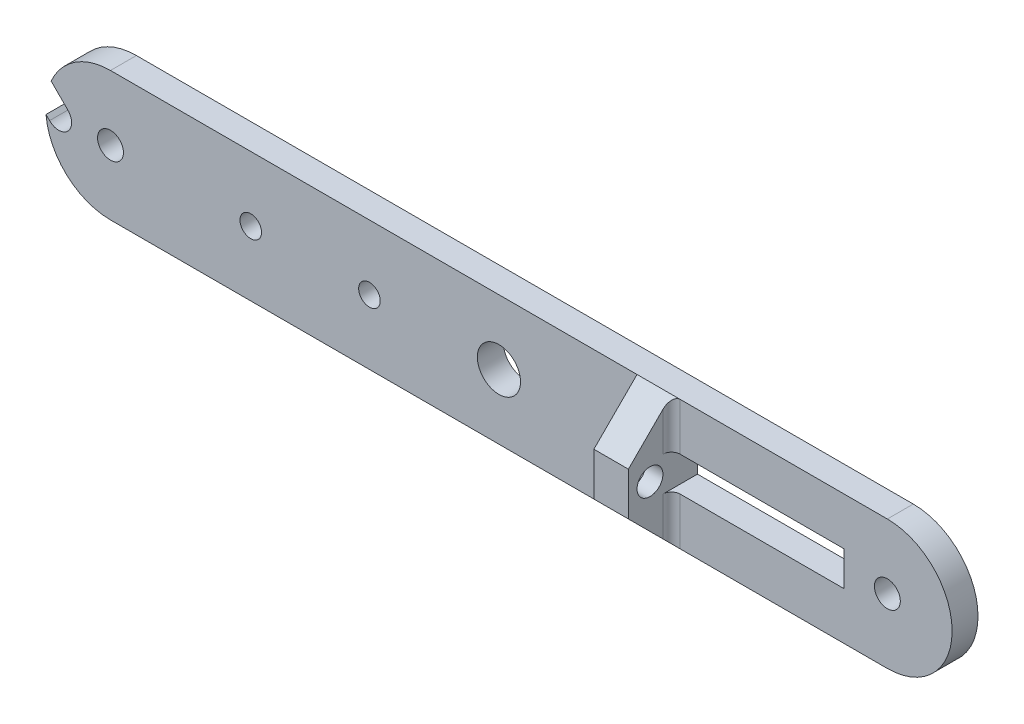
ISO-10303-21;
HEADER;
FILE_DESCRIPTION(('STEP AP214'),'2;1');
FILE_NAME('part.step','',(''),(''),'','','');
FILE_SCHEMA(('AUTOMOTIVE_DESIGN { 1 0 10303 214 1 1 1 1 }'));
ENDSEC;
DATA;
#1=APPLICATION_CONTEXT('core data for automotive mechanical design processes');
#2=APPLICATION_PROTOCOL_DEFINITION('international standard','automotive_design',2000,#1);
#3=PRODUCT_CONTEXT('',#1,'mechanical');
#4=PRODUCT('Part','Part','',(#3));
#5=PRODUCT_RELATED_PRODUCT_CATEGORY('part','',(#4));
#6=PRODUCT_DEFINITION_FORMATION('','',#4);
#7=PRODUCT_DEFINITION_CONTEXT('part definition',#1,'design');
#8=PRODUCT_DEFINITION('design','',#6,#7);
#9=PRODUCT_DEFINITION_SHAPE('','',#8);
#10=(LENGTH_UNIT() NAMED_UNIT(*) SI_UNIT(.MILLI.,.METRE.));
#11=(NAMED_UNIT(*) PLANE_ANGLE_UNIT() SI_UNIT($,.RADIAN.));
#12=(NAMED_UNIT(*) SI_UNIT($,.STERADIAN.) SOLID_ANGLE_UNIT());
#13=UNCERTAINTY_MEASURE_WITH_UNIT(LENGTH_MEASURE(1.E-05),#10,'distance_accuracy_value','');
#14=(GEOMETRIC_REPRESENTATION_CONTEXT(3) GLOBAL_UNCERTAINTY_ASSIGNED_CONTEXT((#13)) GLOBAL_UNIT_ASSIGNED_CONTEXT((#10,
#11,#12)) REPRESENTATION_CONTEXT('',''));
#15=CARTESIAN_POINT('',(0.,0.,0.));
#16=DIRECTION('',(0.,0.,1.));
#17=DIRECTION('',(1.,0.,0.));
#18=AXIS2_PLACEMENT_3D('',#15,#16,#17);
#19=CARTESIAN_POINT('',(90.,0.,6.));
#20=DIRECTION('',(0.,0.,1.));
#21=DIRECTION('',(1.,0.,0.));
#22=AXIS2_PLACEMENT_3D('',#19,#20,#21);
#23=PLANE('',#22);
#24=CARTESIAN_POINT('',(-30.,0.,6.));
#25=DIRECTION('',(0.,0.,1.));
#26=DIRECTION('',(1.,0.,0.));
#27=AXIS2_PLACEMENT_3D('',#24,#25,#26);
#28=CIRCLE('',#27,2.5);
#29=CARTESIAN_POINT('',(-27.5,0.,6.));
#30=VERTEX_POINT('',#29);
#31=EDGE_CURVE('E381',#30,#30,#28,.T.);
#32=ORIENTED_EDGE('',*,*,#31,.F.);
#33=EDGE_LOOP('',(#32));
#34=FACE_BOUND('',#33,.T.);
#35=CARTESIAN_POINT('',(-90.,0.,6.));
#36=DIRECTION('',(0.,0.,1.));
#37=DIRECTION('',(-1.,0.,0.));
#38=AXIS2_PLACEMENT_3D('',#35,#36,#37);
#39=CIRCLE('',#38,3.00000000000001);
#40=CARTESIAN_POINT('',(-93.,0.,6.));
#41=VERTEX_POINT('',#40);
#42=EDGE_CURVE('E393',#41,#41,#39,.T.);
#43=ORIENTED_EDGE('',*,*,#42,.F.);
#44=EDGE_LOOP('',(#43));
#45=FACE_BOUND('',#44,.T.);
#46=CARTESIAN_POINT('',(0.,0.,6.));
#47=DIRECTION('',(0.,0.,1.));
#48=DIRECTION('',(1.,0.,0.));
#49=AXIS2_PLACEMENT_3D('',#46,#47,#48);
#50=CIRCLE('',#49,5.);
#51=CARTESIAN_POINT('',(5.,0.,6.));
#52=VERTEX_POINT('',#51);
#53=EDGE_CURVE('E424',#52,#52,#50,.T.);
#54=ORIENTED_EDGE('',*,*,#53,.F.);
#55=EDGE_LOOP('',(#54));
#56=FACE_BOUND('',#55,.T.);
#57=CARTESIAN_POINT('',(-57.5,0.,6.));
#58=DIRECTION('',(0.,0.,1.));
#59=DIRECTION('',(1.,0.,0.));
#60=AXIS2_PLACEMENT_3D('',#57,#58,#59);
#61=CIRCLE('',#60,2.50000000000001);
#62=CARTESIAN_POINT('',(-55.,0.,6.));
#63=VERTEX_POINT('',#62);
#64=EDGE_CURVE('E387',#63,#63,#61,.T.);
#65=ORIENTED_EDGE('',*,*,#64,.F.);
#66=EDGE_LOOP('',(#65));
#67=FACE_BOUND('',#66,.T.);
#68=CARTESIAN_POINT('',(-102.,0.,6.));
#69=DIRECTION('',(0.,0.,1.));
#70=DIRECTION('',(1.,0.,0.));
#71=AXIS2_PLACEMENT_3D('',#68,#69,#70);
#72=CIRCLE('',#71,3.00000000000001);
#73=CARTESIAN_POINT('',(-104.12132034356,-2.12132034355964,6.));
#74=VERTEX_POINT('',#73);
#75=CARTESIAN_POINT('',(-99.8786796564403,2.12132034355964,6.));
#76=VERTEX_POINT('',#75);
#77=EDGE_CURVE('E199',#74,#76,#72,.T.);
#78=ORIENTED_EDGE('',*,*,#77,.F.);
#79=DIRECTION('',(-0.707106781186549,0.707106781186547,0.));
#80=VECTOR('',#79,1.);
#81=CARTESIAN_POINT('',(-53.1213203435595,-53.1213203435596,6.));
#82=LINE('',#81,#80);
#83=CARTESIAN_POINT('',(-104.943648089812,-1.29899259730732,6.));
#84=VERTEX_POINT('',#83);
#85=EDGE_CURVE('E205',#74,#84,#82,.T.);
#86=ORIENTED_EDGE('',*,*,#85,.T.);
#87=CARTESIAN_POINT('',(-90.,0.,6.));
#88=DIRECTION('',(0.,0.,1.));
#89=DIRECTION('',(-1.,0.,0.));
#90=AXIS2_PLACEMENT_3D('',#87,#88,#89);
#91=CIRCLE('',#90,15.);
#92=CARTESIAN_POINT('',(-90.,-15.,6.));
#93=VERTEX_POINT('',#92);
#94=EDGE_CURVE('E349',#84,#93,#91,.T.);
#95=ORIENTED_EDGE('',*,*,#94,.T.);
#96=DIRECTION('',(1.,0.,0.));
#97=VECTOR('',#96,1.);
#98=CARTESIAN_POINT('',(90.,-15.,6.));
#99=LINE('',#98,#97);
#100=CARTESIAN_POINT('',(32.,-15.,6.));
#101=VERTEX_POINT('',#100);
#102=EDGE_CURVE('E351',#93,#101,#99,.T.);
#103=ORIENTED_EDGE('',*,*,#102,.T.);
#104=DIRECTION('',(0.,1.,0.));
#105=VECTOR('',#104,1.);
#106=CARTESIAN_POINT('',(32.,-15.,6.));
#107=LINE('',#106,#105);
#108=CARTESIAN_POINT('',(32.,15.,6.));
#109=VERTEX_POINT('',#108);
#110=EDGE_CURVE('E277',#101,#109,#107,.T.);
#111=ORIENTED_EDGE('',*,*,#110,.T.);
#112=DIRECTION('',(-1.,0.,0.));
#113=VECTOR('',#112,1.);
#114=CARTESIAN_POINT('',(90.,15.,6.));
#115=LINE('',#114,#113);
#116=CARTESIAN_POINT('',(-90.,15.,6.));
#117=VERTEX_POINT('',#116);
#118=EDGE_CURVE('E347',#109,#117,#115,.T.);
#119=ORIENTED_EDGE('',*,*,#118,.T.);
#120=CARTESIAN_POINT('',(-103.750652312537,5.9932929996561,6.));
#121=VERTEX_POINT('',#120);
#122=EDGE_CURVE('E343',#117,#121,#91,.T.);
#123=ORIENTED_EDGE('',*,*,#122,.T.);
#124=DIRECTION('',(-0.707106781186548,0.707106781186548,0.));
#125=VECTOR('',#124,1.);
#126=CARTESIAN_POINT('',(-48.8786796564403,-48.8786796564403,6.));
#127=LINE('',#126,#125);
#128=EDGE_CURVE('E48',#76,#121,#127,.T.);
#129=ORIENTED_EDGE('',*,*,#128,.F.);
#130=EDGE_LOOP('',(#78,#86,#95,#103,#111,#119,#123,#129));
#131=FACE_BOUND('',#130,.T.);
#132=ADVANCED_FACE('F33',(#34,#45,#56,#67,#131),#23,.T.);
#133=CARTESIAN_POINT('',(90.,0.,0.));
#134=DIRECTION('',(0.,0.,1.));
#135=DIRECTION('',(1.,0.,0.));
#136=AXIS2_PLACEMENT_3D('',#133,#134,#135);
#137=PLANE('',#136);
#138=CARTESIAN_POINT('',(-30.,0.,0.));
#139=DIRECTION('',(0.,0.,1.));
#140=DIRECTION('',(1.,0.,0.));
#141=AXIS2_PLACEMENT_3D('',#138,#139,#140);
#142=CIRCLE('',#141,2.5);
#143=CARTESIAN_POINT('',(-27.5,0.,0.));
#144=VERTEX_POINT('',#143);
#145=EDGE_CURVE('E287',#144,#144,#142,.T.);
#146=ORIENTED_EDGE('',*,*,#145,.T.);
#147=EDGE_LOOP('',(#146));
#148=FACE_BOUND('',#147,.T.);
#149=CARTESIAN_POINT('',(-57.5,0.,0.));
#150=DIRECTION('',(0.,0.,1.));
#151=DIRECTION('',(1.,0.,0.));
#152=AXIS2_PLACEMENT_3D('',#149,#150,#151);
#153=CIRCLE('',#152,2.50000000000001);
#154=CARTESIAN_POINT('',(-55.,0.,0.));
#155=VERTEX_POINT('',#154);
#156=EDGE_CURVE('E384',#155,#155,#153,.T.);
#157=ORIENTED_EDGE('',*,*,#156,.T.);
#158=EDGE_LOOP('',(#157));
#159=FACE_BOUND('',#158,.T.);
#160=CARTESIAN_POINT('',(-90.,0.,0.));
#161=DIRECTION('',(0.,0.,1.));
#162=DIRECTION('',(-1.,0.,0.));
#163=AXIS2_PLACEMENT_3D('',#160,#161,#162);
#164=CIRCLE('',#163,3.00000000000001);
#165=CARTESIAN_POINT('',(-93.,0.,0.));
#166=VERTEX_POINT('',#165);
#167=EDGE_CURVE('E390',#166,#166,#164,.T.);
#168=ORIENTED_EDGE('',*,*,#167,.T.);
#169=EDGE_LOOP('',(#168));
#170=FACE_BOUND('',#169,.T.);
#171=DIRECTION('',(0.,1.,0.));
#172=VECTOR('',#171,1.);
#173=CARTESIAN_POINT('',(80.,-4.,0.));
#174=LINE('',#173,#172);
#175=CARTESIAN_POINT('',(80.,-4.,0.));
#176=VERTEX_POINT('',#175);
#177=CARTESIAN_POINT('',(80.,4.,0.));
#178=VERTEX_POINT('',#177);
#179=EDGE_CURVE('E396',#176,#178,#174,.T.);
#180=ORIENTED_EDGE('',*,*,#179,.T.);
#181=DIRECTION('',(-1.,0.,0.));
#182=VECTOR('',#181,1.);
#183=CARTESIAN_POINT('',(40.,4.,0.));
#184=LINE('',#183,#182);
#185=CARTESIAN_POINT('',(40.,4.,0.));
#186=VERTEX_POINT('',#185);
#187=EDGE_CURVE('E404',#178,#186,#184,.T.);
#188=ORIENTED_EDGE('',*,*,#187,.T.);
#189=DIRECTION('',(0.,-1.,0.));
#190=VECTOR('',#189,1.);
#191=CARTESIAN_POINT('',(40.,-4.,0.));
#192=LINE('',#191,#190);
#193=CARTESIAN_POINT('',(40.,-4.,0.));
#194=VERTEX_POINT('',#193);
#195=EDGE_CURVE('E407',#186,#194,#192,.T.);
#196=ORIENTED_EDGE('',*,*,#195,.T.);
#197=DIRECTION('',(1.,0.,0.));
#198=VECTOR('',#197,1.);
#199=CARTESIAN_POINT('',(40.,-4.,0.));
#200=LINE('',#199,#198);
#201=EDGE_CURVE('E401',#194,#176,#200,.T.);
#202=ORIENTED_EDGE('',*,*,#201,.T.);
#203=EDGE_LOOP('',(#180,#188,#196,#202));
#204=FACE_BOUND('',#203,.T.);
#205=CARTESIAN_POINT('',(0.,0.,0.));
#206=DIRECTION('',(0.,0.,1.));
#207=DIRECTION('',(1.,0.,0.));
#208=AXIS2_PLACEMENT_3D('',#205,#206,#207);
#209=CIRCLE('',#208,5.);
#210=CARTESIAN_POINT('',(5.,0.,0.));
#211=VERTEX_POINT('',#210);
#212=EDGE_CURVE('E421',#211,#211,#209,.T.);
#213=ORIENTED_EDGE('',*,*,#212,.T.);
#214=EDGE_LOOP('',(#213));
#215=FACE_BOUND('',#214,.T.);
#216=CARTESIAN_POINT('',(90.,0.,0.));
#217=DIRECTION('',(0.,0.,1.));
#218=DIRECTION('',(1.,0.,0.));
#219=AXIS2_PLACEMENT_3D('',#216,#217,#218);
#220=CIRCLE('',#219,3.00000000000001);
#221=CARTESIAN_POINT('',(93.,0.,0.));
#222=VERTEX_POINT('',#221);
#223=EDGE_CURVE('E417',#222,#222,#220,.T.);
#224=ORIENTED_EDGE('',*,*,#223,.T.);
#225=EDGE_LOOP('',(#224));
#226=FACE_BOUND('',#225,.T.);
#227=DIRECTION('',(-0.707106781186549,0.707106781186547,0.));
#228=VECTOR('',#227,1.);
#229=CARTESIAN_POINT('',(-8.12132034355938,-98.1213203435596,0.));
#230=LINE('',#229,#228);
#231=CARTESIAN_POINT('',(-104.12132034356,-2.12132034355964,0.));
#232=VERTEX_POINT('',#231);
#233=CARTESIAN_POINT('',(-104.943648089812,-1.29899259730732,0.));
#234=VERTEX_POINT('',#233);
#235=EDGE_CURVE('E219',#232,#234,#230,.T.);
#236=ORIENTED_EDGE('',*,*,#235,.F.);
#237=CARTESIAN_POINT('',(-102.,0.,0.));
#238=DIRECTION('',(0.,0.,1.));
#239=DIRECTION('',(1.,0.,0.));
#240=AXIS2_PLACEMENT_3D('',#237,#238,#239);
#241=CIRCLE('',#240,3.00000000000001);
#242=CARTESIAN_POINT('',(-99.8786796564403,2.12132034355964,0.));
#243=VERTEX_POINT('',#242);
#244=EDGE_CURVE('E11',#232,#243,#241,.T.);
#245=ORIENTED_EDGE('',*,*,#244,.T.);
#246=DIRECTION('',(-0.707106781186548,0.707106781186548,0.));
#247=VECTOR('',#246,1.);
#248=CARTESIAN_POINT('',(-3.87867965644031,-93.8786796564403,0.));
#249=LINE('',#248,#247);
#250=CARTESIAN_POINT('',(-103.750652312537,5.9932929996561,0.));
#251=VERTEX_POINT('',#250);
#252=EDGE_CURVE('E215',#243,#251,#249,.T.);
#253=ORIENTED_EDGE('',*,*,#252,.T.);
#254=CARTESIAN_POINT('',(-90.,0.,0.));
#255=DIRECTION('',(0.,0.,1.));
#256=DIRECTION('',(-1.,0.,0.));
#257=AXIS2_PLACEMENT_3D('',#254,#255,#256);
#258=CIRCLE('',#257,15.);
#259=CARTESIAN_POINT('',(-90.,15.,0.));
#260=VERTEX_POINT('',#259);
#261=EDGE_CURVE('E345',#260,#251,#258,.T.);
#262=ORIENTED_EDGE('',*,*,#261,.F.);
#263=DIRECTION('',(-1.,0.,0.));
#264=VECTOR('',#263,1.);
#265=CARTESIAN_POINT('',(90.,15.,0.));
#266=LINE('',#265,#264);
#267=CARTESIAN_POINT('',(90.,15.,0.));
#268=VERTEX_POINT('',#267);
#269=EDGE_CURVE('E495',#268,#260,#266,.T.);
#270=ORIENTED_EDGE('',*,*,#269,.F.);
#271=CARTESIAN_POINT('',(90.,0.,0.));
#272=DIRECTION('',(0.,0.,1.));
#273=DIRECTION('',(1.,0.,0.));
#274=AXIS2_PLACEMENT_3D('',#271,#272,#273);
#275=CIRCLE('',#274,15.);
#276=CARTESIAN_POINT('',(90.,-15.,0.));
#277=VERTEX_POINT('',#276);
#278=EDGE_CURVE('E358',#277,#268,#275,.T.);
#279=ORIENTED_EDGE('',*,*,#278,.F.);
#280=DIRECTION('',(1.,0.,0.));
#281=VECTOR('',#280,1.);
#282=CARTESIAN_POINT('',(90.,-15.,0.));
#283=LINE('',#282,#281);
#284=CARTESIAN_POINT('',(-90.,-15.,0.));
#285=VERTEX_POINT('',#284);
#286=EDGE_CURVE('E430',#285,#277,#283,.T.);
#287=ORIENTED_EDGE('',*,*,#286,.F.);
#288=EDGE_CURVE('E440',#234,#285,#258,.T.);
#289=ORIENTED_EDGE('',*,*,#288,.F.);
#290=EDGE_LOOP('',(#236,#245,#253,#262,#270,#279,#287,#289));
#291=FACE_BOUND('',#290,.T.);
#292=ADVANCED_FACE('F476',(#148,#159,#170,#204,#215,#226,#291),#137,.F.);
#293=CARTESIAN_POINT('',(-90.,0.,6.));
#294=DIRECTION('',(0.,0.,-1.));
#295=DIRECTION('',(-1.,0.,0.));
#296=AXIS2_PLACEMENT_3D('',#293,#294,#295);
#297=CYLINDRICAL_SURFACE('',#296,15.);
#298=DIRECTION('',(0.,0.,-1.));
#299=VECTOR('',#298,1.);
#300=CARTESIAN_POINT('',(-104.943648089812,-1.29899259730732,6.));
#301=LINE('',#300,#299);
#302=EDGE_CURVE('E41',#234,#84,#301,.F.);
#303=ORIENTED_EDGE('',*,*,#302,.F.);
#304=ORIENTED_EDGE('',*,*,#288,.T.);
#305=DIRECTION('',(0.,0.,-1.));
#306=VECTOR('',#305,1.);
#307=CARTESIAN_POINT('',(-90.,-15.,6.));
#308=LINE('',#307,#306);
#309=EDGE_CURVE('E444',#93,#285,#308,.T.);
#310=ORIENTED_EDGE('',*,*,#309,.F.);
#311=ORIENTED_EDGE('',*,*,#94,.F.);
#312=EDGE_LOOP('',(#303,#304,#310,#311));
#313=FACE_BOUND('',#312,.T.);
#314=ADVANCED_FACE('F511',(#313),#297,.T.);
#315=CARTESIAN_POINT('',(90.,15.,6.));
#316=VERTEX_POINT('',#315);
#317=CARTESIAN_POINT('',(42.,15.,6.));
#318=VERTEX_POINT('',#317);
#319=EDGE_CURVE('E352',#316,#318,#115,.T.);
#320=ORIENTED_EDGE('',*,*,#319,.T.);
#321=DIRECTION('',(0.,1.,0.));
#322=VECTOR('',#321,1.);
#323=CARTESIAN_POINT('',(42.,4.,6.));
#324=LINE('',#323,#322);
#325=CARTESIAN_POINT('',(42.,4.,6.));
#326=VERTEX_POINT('',#325);
#327=EDGE_CURVE('E322',#318,#326,#324,.F.);
#328=ORIENTED_EDGE('',*,*,#327,.T.);
#329=DIRECTION('',(-1.,0.,0.));
#330=VECTOR('',#329,1.);
#331=CARTESIAN_POINT('',(40.,4.,6.));
#332=LINE('',#331,#330);
#333=CARTESIAN_POINT('',(80.,4.,6.));
#334=VERTEX_POINT('',#333);
#335=EDGE_CURVE('E310',#334,#326,#332,.T.);
#336=ORIENTED_EDGE('',*,*,#335,.F.);
#337=DIRECTION('',(0.,1.,0.));
#338=VECTOR('',#337,1.);
#339=CARTESIAN_POINT('',(80.,-4.,6.));
#340=LINE('',#339,#338);
#341=CARTESIAN_POINT('',(80.,-4.,6.));
#342=VERTEX_POINT('',#341);
#343=EDGE_CURVE('E399',#342,#334,#340,.T.);
#344=ORIENTED_EDGE('',*,*,#343,.F.);
#345=DIRECTION('',(1.,0.,0.));
#346=VECTOR('',#345,1.);
#347=CARTESIAN_POINT('',(40.,-4.,6.));
#348=LINE('',#347,#346);
#349=CARTESIAN_POINT('',(42.,-4.,6.));
#350=VERTEX_POINT('',#349);
#351=EDGE_CURVE('E313',#350,#342,#348,.T.);
#352=ORIENTED_EDGE('',*,*,#351,.F.);
#353=DIRECTION('',(0.,1.,0.));
#354=VECTOR('',#353,1.);
#355=CARTESIAN_POINT('',(42.,-15.,6.));
#356=LINE('',#355,#354);
#357=CARTESIAN_POINT('',(42.,-15.,6.));
#358=VERTEX_POINT('',#357);
#359=EDGE_CURVE('E319',#350,#358,#356,.F.);
#360=ORIENTED_EDGE('',*,*,#359,.T.);
#361=CARTESIAN_POINT('',(90.,-15.,6.));
#362=VERTEX_POINT('',#361);
#363=EDGE_CURVE('E316',#358,#362,#99,.T.);
#364=ORIENTED_EDGE('',*,*,#363,.T.);
#365=CARTESIAN_POINT('',(90.,0.,6.));
#366=DIRECTION('',(0.,0.,1.));
#367=DIRECTION('',(1.,0.,0.));
#368=AXIS2_PLACEMENT_3D('',#365,#366,#367);
#369=CIRCLE('',#368,15.);
#370=EDGE_CURVE('E428',#362,#316,#369,.T.);
#371=ORIENTED_EDGE('',*,*,#370,.T.);
#372=EDGE_LOOP('',(#320,#328,#336,#344,#352,#360,#364,#371));
#373=FACE_BOUND('',#372,.T.);
#374=CARTESIAN_POINT('',(90.,0.,6.));
#375=DIRECTION('',(0.,0.,1.));
#376=DIRECTION('',(1.,0.,0.));
#377=AXIS2_PLACEMENT_3D('',#374,#375,#376);
#378=CIRCLE('',#377,3.00000000000001);
#379=CARTESIAN_POINT('',(93.,0.,6.));
#380=VERTEX_POINT('',#379);
#381=EDGE_CURVE('E418',#380,#380,#378,.T.);
#382=ORIENTED_EDGE('',*,*,#381,.F.);
#383=EDGE_LOOP('',(#382));
#384=FACE_BOUND('',#383,.T.);
#385=ADVANCED_FACE('F451',(#373,#384),#23,.T.);
#386=CARTESIAN_POINT('',(90.,0.,6.));
#387=DIRECTION('',(0.,0.,-1.));
#388=DIRECTION('',(-1.,0.,0.));
#389=AXIS2_PLACEMENT_3D('',#386,#387,#388);
#390=CYLINDRICAL_SURFACE('',#389,15.);
#391=ORIENTED_EDGE('',*,*,#278,.T.);
#392=DIRECTION('',(0.,0.,-1.));
#393=VECTOR('',#392,1.);
#394=CARTESIAN_POINT('',(90.,15.,6.));
#395=LINE('',#394,#393);
#396=EDGE_CURVE('E448',#316,#268,#395,.T.);
#397=ORIENTED_EDGE('',*,*,#396,.F.);
#398=ORIENTED_EDGE('',*,*,#370,.F.);
#399=DIRECTION('',(0.,0.,-1.));
#400=VECTOR('',#399,1.);
#401=CARTESIAN_POINT('',(90.,-15.,6.));
#402=LINE('',#401,#400);
#403=EDGE_CURVE('E365',#362,#277,#402,.T.);
#404=ORIENTED_EDGE('',*,*,#403,.T.);
#405=EDGE_LOOP('',(#391,#397,#398,#404));
#406=FACE_BOUND('',#405,.T.);
#407=ADVANCED_FACE('F493',(#406),#390,.T.);
#408=CARTESIAN_POINT('',(90.,15.,6.));
#409=DIRECTION('',(0.,-1.,0.));
#410=DIRECTION('',(0.,0.,-1.));
#411=AXIS2_PLACEMENT_3D('',#408,#409,#410);
#412=PLANE('',#411);
#413=ORIENTED_EDGE('',*,*,#269,.T.);
#414=DIRECTION('',(0.,0.,-1.));
#415=VECTOR('',#414,1.);
#416=CARTESIAN_POINT('',(-90.,15.,6.));
#417=LINE('',#416,#415);
#418=EDGE_CURVE('E446',#117,#260,#417,.T.);
#419=ORIENTED_EDGE('',*,*,#418,.F.);
#420=ORIENTED_EDGE('',*,*,#118,.F.);
#421=DIRECTION('',(1.,0.,0.));
#422=VECTOR('',#421,1.);
#423=CARTESIAN_POINT('',(32.,15.,6.));
#424=LINE('',#423,#422);
#425=EDGE_CURVE('E294',#109,#318,#424,.T.);
#426=ORIENTED_EDGE('',*,*,#425,.T.);
#427=ORIENTED_EDGE('',*,*,#319,.F.);
#428=ORIENTED_EDGE('',*,*,#396,.T.);
#429=EDGE_LOOP('',(#413,#419,#420,#426,#427,#428));
#430=FACE_BOUND('',#429,.T.);
#431=ADVANCED_FACE('F494',(#430),#412,.F.);
#432=ORIENTED_EDGE('',*,*,#261,.T.);
#433=DIRECTION('',(0.,0.,-1.));
#434=VECTOR('',#433,1.);
#435=CARTESIAN_POINT('',(-103.750652312537,5.9932929996561,6.));
#436=LINE('',#435,#434);
#437=EDGE_CURVE('E335',#251,#121,#436,.F.);
#438=ORIENTED_EDGE('',*,*,#437,.T.);
#439=ORIENTED_EDGE('',*,*,#122,.F.);
#440=ORIENTED_EDGE('',*,*,#418,.T.);
#441=EDGE_LOOP('',(#432,#438,#439,#440));
#442=FACE_BOUND('',#441,.T.);
#443=ADVANCED_FACE('F341',(#442),#297,.T.);
#444=CARTESIAN_POINT('',(90.,-15.,6.));
#445=DIRECTION('',(0.,1.,0.));
#446=DIRECTION('',(0.,0.,1.));
#447=AXIS2_PLACEMENT_3D('',#444,#445,#446);
#448=PLANE('',#447);
#449=ORIENTED_EDGE('',*,*,#286,.T.);
#450=ORIENTED_EDGE('',*,*,#403,.F.);
#451=ORIENTED_EDGE('',*,*,#363,.F.);
#452=DIRECTION('',(1.,0.,0.));
#453=VECTOR('',#452,1.);
#454=CARTESIAN_POINT('',(32.,-15.,6.));
#455=LINE('',#454,#453);
#456=EDGE_CURVE('E285',#101,#358,#455,.T.);
#457=ORIENTED_EDGE('',*,*,#456,.F.);
#458=ORIENTED_EDGE('',*,*,#102,.F.);
#459=ORIENTED_EDGE('',*,*,#309,.T.);
#460=EDGE_LOOP('',(#449,#450,#451,#457,#458,#459));
#461=FACE_BOUND('',#460,.T.);
#462=ADVANCED_FACE('F488',(#461),#448,.F.);
#463=CARTESIAN_POINT('',(0.,0.,6.));
#464=DIRECTION('',(0.,0.,-1.));
#465=DIRECTION('',(-1.,0.,0.));
#466=AXIS2_PLACEMENT_3D('',#463,#464,#465);
#467=CYLINDRICAL_SURFACE('',#466,5.);
#468=ORIENTED_EDGE('',*,*,#53,.T.);
#469=EDGE_LOOP('',(#468));
#470=FACE_BOUND('',#469,.T.);
#471=ORIENTED_EDGE('',*,*,#212,.F.);
#472=EDGE_LOOP('',(#471));
#473=FACE_BOUND('',#472,.T.);
#474=ADVANCED_FACE('F534',(#470,#473),#467,.F.);
#475=CARTESIAN_POINT('',(90.,0.,6.));
#476=DIRECTION('',(0.,0.,-1.));
#477=DIRECTION('',(-1.,0.,0.));
#478=AXIS2_PLACEMENT_3D('',#475,#476,#477);
#479=CYLINDRICAL_SURFACE('',#478,3.00000000000001);
#480=ORIENTED_EDGE('',*,*,#381,.T.);
#481=EDGE_LOOP('',(#480));
#482=FACE_BOUND('',#481,.T.);
#483=ORIENTED_EDGE('',*,*,#223,.F.);
#484=EDGE_LOOP('',(#483));
#485=FACE_BOUND('',#484,.T.);
#486=ADVANCED_FACE('F587',(#482,#485),#479,.F.);
#487=CARTESIAN_POINT('',(80.,-4.,6.));
#488=DIRECTION('',(-1.,0.,0.));
#489=DIRECTION('',(0.,0.,1.));
#490=AXIS2_PLACEMENT_3D('',#487,#488,#489);
#491=PLANE('',#490);
#492=ORIENTED_EDGE('',*,*,#179,.F.);
#493=DIRECTION('',(0.,0.,-1.));
#494=VECTOR('',#493,1.);
#495=CARTESIAN_POINT('',(80.,-4.,6.));
#496=LINE('',#495,#494);
#497=EDGE_CURVE('E305',#342,#176,#496,.T.);
#498=ORIENTED_EDGE('',*,*,#497,.F.);
#499=ORIENTED_EDGE('',*,*,#343,.T.);
#500=DIRECTION('',(0.,0.,-1.));
#501=VECTOR('',#500,1.);
#502=CARTESIAN_POINT('',(80.,4.,6.));
#503=LINE('',#502,#501);
#504=EDGE_CURVE('E414',#334,#178,#503,.T.);
#505=ORIENTED_EDGE('',*,*,#504,.T.);
#506=EDGE_LOOP('',(#492,#498,#499,#505));
#507=FACE_BOUND('',#506,.T.);
#508=ADVANCED_FACE('F471',(#507),#491,.T.);
#509=CARTESIAN_POINT('',(40.,4.,6.));
#510=DIRECTION('',(0.,-1.,0.));
#511=DIRECTION('',(0.,0.,-1.));
#512=AXIS2_PLACEMENT_3D('',#509,#510,#511);
#513=PLANE('',#512);
#514=ORIENTED_EDGE('',*,*,#187,.F.);
#515=ORIENTED_EDGE('',*,*,#504,.F.);
#516=ORIENTED_EDGE('',*,*,#335,.T.);
#517=CARTESIAN_POINT('',(42.,4.,8.));
#518=DIRECTION('',(0.,-1.,0.));
#519=DIRECTION('',(0.,0.,-1.));
#520=AXIS2_PLACEMENT_3D('',#517,#518,#519);
#521=CIRCLE('',#520,2.);
#522=CARTESIAN_POINT('',(40.,4.,8.));
#523=VERTEX_POINT('',#522);
#524=EDGE_CURVE('E328',#326,#523,#521,.F.);
#525=ORIENTED_EDGE('',*,*,#524,.T.);
#526=DIRECTION('',(0.,0.,-1.));
#527=VECTOR('',#526,1.);
#528=CARTESIAN_POINT('',(40.,4.,6.));
#529=LINE('',#528,#527);
#530=EDGE_CURVE('E304',#523,#186,#529,.T.);
#531=ORIENTED_EDGE('',*,*,#530,.T.);
#532=EDGE_LOOP('',(#514,#515,#516,#525,#531));
#533=FACE_BOUND('',#532,.T.);
#534=ADVANCED_FACE('F463',(#533),#513,.T.);
#535=CARTESIAN_POINT('',(40.,-4.,6.));
#536=DIRECTION('',(1.,0.,0.));
#537=DIRECTION('',(0.,0.,-1.));
#538=AXIS2_PLACEMENT_3D('',#535,#536,#537);
#539=PLANE('',#538);
#540=ORIENTED_EDGE('',*,*,#530,.F.);
#541=DIRECTION('',(0.,1.,0.));
#542=VECTOR('',#541,1.);
#543=CARTESIAN_POINT('',(40.,15.,8.));
#544=LINE('',#543,#542);
#545=CARTESIAN_POINT('',(40.,13.,8.));
#546=VERTEX_POINT('',#545);
#547=EDGE_CURVE('E323',#523,#546,#544,.T.);
#548=ORIENTED_EDGE('',*,*,#547,.T.);
#549=DIRECTION('',(0.,-0.707106781186548,0.707106781186548));
#550=VECTOR('',#549,1.);
#551=CARTESIAN_POINT('',(40.,15.,6.));
#552=LINE('',#551,#550);
#553=CARTESIAN_POINT('',(40.,5.,16.));
#554=VERTEX_POINT('',#553);
#555=EDGE_CURVE('E271',#546,#554,#552,.T.);
#556=ORIENTED_EDGE('',*,*,#555,.T.);
#557=DIRECTION('',(0.,-1.,0.));
#558=VECTOR('',#557,1.);
#559=CARTESIAN_POINT('',(40.,5.,16.));
#560=LINE('',#559,#558);
#561=CARTESIAN_POINT('',(40.,-5.,16.));
#562=VERTEX_POINT('',#561);
#563=EDGE_CURVE('E299',#554,#562,#560,.T.);
#564=ORIENTED_EDGE('',*,*,#563,.T.);
#565=DIRECTION('',(0.,-0.707106781186547,-0.707106781186548));
#566=VECTOR('',#565,1.);
#567=CARTESIAN_POINT('',(40.,-15.,6.));
#568=LINE('',#567,#566);
#569=CARTESIAN_POINT('',(40.,-13.,8.));
#570=VERTEX_POINT('',#569);
#571=EDGE_CURVE('E282',#562,#570,#568,.T.);
#572=ORIENTED_EDGE('',*,*,#571,.T.);
#573=DIRECTION('',(0.,1.,0.));
#574=VECTOR('',#573,1.);
#575=CARTESIAN_POINT('',(40.,-4.,8.));
#576=LINE('',#575,#574);
#577=CARTESIAN_POINT('',(40.,-4.,8.));
#578=VERTEX_POINT('',#577);
#579=EDGE_CURVE('E450',#570,#578,#576,.T.);
#580=ORIENTED_EDGE('',*,*,#579,.T.);
#581=DIRECTION('',(0.,0.,-1.));
#582=VECTOR('',#581,1.);
#583=CARTESIAN_POINT('',(40.,-4.,6.));
#584=LINE('',#583,#582);
#585=EDGE_CURVE('E302',#578,#194,#584,.T.);
#586=ORIENTED_EDGE('',*,*,#585,.T.);
#587=ORIENTED_EDGE('',*,*,#195,.F.);
#588=EDGE_LOOP('',(#540,#548,#556,#564,#572,#580,#586,#587));
#589=FACE_BOUND('',#588,.T.);
#590=CARTESIAN_POINT('',(40.,0.,11.));
#591=DIRECTION('',(1.,0.,0.));
#592=DIRECTION('',(0.,0.,-1.));
#593=AXIS2_PLACEMENT_3D('',#590,#591,#592);
#594=CIRCLE('',#593,3.);
#595=CARTESIAN_POINT('',(40.,0.,8.));
#596=VERTEX_POINT('',#595);
#597=EDGE_CURVE('E268',#596,#596,#594,.T.);
#598=ORIENTED_EDGE('',*,*,#597,.F.);
#599=EDGE_LOOP('',(#598));
#600=FACE_BOUND('',#599,.T.);
#601=ADVANCED_FACE('F479',(#589,#600),#539,.T.);
#602=CARTESIAN_POINT('',(40.,-4.,6.));
#603=DIRECTION('',(0.,1.,0.));
#604=DIRECTION('',(0.,0.,1.));
#605=AXIS2_PLACEMENT_3D('',#602,#603,#604);
#606=PLANE('',#605);
#607=ORIENTED_EDGE('',*,*,#201,.F.);
#608=ORIENTED_EDGE('',*,*,#585,.F.);
#609=CARTESIAN_POINT('',(42.,-4.,8.));
#610=DIRECTION('',(0.,1.,0.));
#611=DIRECTION('',(0.,0.,1.));
#612=AXIS2_PLACEMENT_3D('',#609,#610,#611);
#613=CIRCLE('',#612,2.);
#614=EDGE_CURVE('E331',#578,#350,#613,.F.);
#615=ORIENTED_EDGE('',*,*,#614,.T.);
#616=ORIENTED_EDGE('',*,*,#351,.T.);
#617=ORIENTED_EDGE('',*,*,#497,.T.);
#618=EDGE_LOOP('',(#607,#608,#615,#616,#617));
#619=FACE_BOUND('',#618,.T.);
#620=ADVANCED_FACE('F474',(#619),#606,.T.);
#621=CARTESIAN_POINT('',(-90.,0.,6.));
#622=DIRECTION('',(0.,0.,-1.));
#623=DIRECTION('',(-1.,0.,0.));
#624=AXIS2_PLACEMENT_3D('',#621,#622,#623);
#625=CYLINDRICAL_SURFACE('',#624,3.00000000000001);
#626=ORIENTED_EDGE('',*,*,#42,.T.);
#627=EDGE_LOOP('',(#626));
#628=FACE_BOUND('',#627,.T.);
#629=ORIENTED_EDGE('',*,*,#167,.F.);
#630=EDGE_LOOP('',(#629));
#631=FACE_BOUND('',#630,.T.);
#632=ADVANCED_FACE('F574',(#628,#631),#625,.F.);
#633=CARTESIAN_POINT('',(-57.5,0.,6.));
#634=DIRECTION('',(0.,0.,-1.));
#635=DIRECTION('',(-1.,0.,0.));
#636=AXIS2_PLACEMENT_3D('',#633,#634,#635);
#637=CYLINDRICAL_SURFACE('',#636,2.50000000000001);
#638=ORIENTED_EDGE('',*,*,#64,.T.);
#639=EDGE_LOOP('',(#638));
#640=FACE_BOUND('',#639,.T.);
#641=ORIENTED_EDGE('',*,*,#156,.F.);
#642=EDGE_LOOP('',(#641));
#643=FACE_BOUND('',#642,.T.);
#644=ADVANCED_FACE('F570',(#640,#643),#637,.F.);
#645=CARTESIAN_POINT('',(-30.,0.,6.));
#646=DIRECTION('',(0.,0.,-1.));
#647=DIRECTION('',(-1.,0.,0.));
#648=AXIS2_PLACEMENT_3D('',#645,#646,#647);
#649=CYLINDRICAL_SURFACE('',#648,2.5);
#650=ORIENTED_EDGE('',*,*,#31,.T.);
#651=EDGE_LOOP('',(#650));
#652=FACE_BOUND('',#651,.T.);
#653=ORIENTED_EDGE('',*,*,#145,.F.);
#654=EDGE_LOOP('',(#653));
#655=FACE_BOUND('',#654,.T.);
#656=ADVANCED_FACE('F561',(#652,#655),#649,.F.);
#657=CARTESIAN_POINT('',(32.,-15.,6.));
#658=DIRECTION('',(0.,-0.707106781186548,0.707106781186547));
#659=DIRECTION('',(0.,-0.707106781186547,-0.707106781186548));
#660=AXIS2_PLACEMENT_3D('',#657,#658,#659);
#661=PLANE('',#660);
#662=ORIENTED_EDGE('',*,*,#571,.F.);
#663=DIRECTION('',(1.,0.,0.));
#664=VECTOR('',#663,1.);
#665=CARTESIAN_POINT('',(32.,-5.,16.));
#666=LINE('',#665,#664);
#667=CARTESIAN_POINT('',(32.,-5.,16.));
#668=VERTEX_POINT('',#667);
#669=EDGE_CURVE('E288',#668,#562,#666,.T.);
#670=ORIENTED_EDGE('',*,*,#669,.F.);
#671=DIRECTION('',(0.,-0.707106781186547,-0.707106781186548));
#672=VECTOR('',#671,1.);
#673=CARTESIAN_POINT('',(32.,-15.,6.));
#674=LINE('',#673,#672);
#675=EDGE_CURVE('E291',#668,#101,#674,.T.);
#676=ORIENTED_EDGE('',*,*,#675,.T.);
#677=ORIENTED_EDGE('',*,*,#456,.T.);
#678=CARTESIAN_POINT('',(42.,-13.,8.));
#679=DIRECTION('',(0.,-0.707106781186548,0.707106781186547));
#680=DIRECTION('',(0.,-0.707106781186547,-0.707106781186548));
#681=AXIS2_PLACEMENT_3D('',#678,#679,#680);
#682=ELLIPSE('',#681,2.82842712474619,2.);
#683=EDGE_CURVE('E333',#358,#570,#682,.F.);
#684=ORIENTED_EDGE('',*,*,#683,.T.);
#685=EDGE_LOOP('',(#662,#670,#676,#677,#684));
#686=FACE_BOUND('',#685,.T.);
#687=ADVANCED_FACE('F557',(#686),#661,.T.);
#688=CARTESIAN_POINT('',(32.,5.,16.));
#689=DIRECTION('',(0.,0.,1.));
#690=DIRECTION('',(1.,0.,0.));
#691=AXIS2_PLACEMENT_3D('',#688,#689,#690);
#692=PLANE('',#691);
#693=ORIENTED_EDGE('',*,*,#563,.F.);
#694=DIRECTION('',(1.,0.,0.));
#695=VECTOR('',#694,1.);
#696=CARTESIAN_POINT('',(32.,5.,16.));
#697=LINE('',#696,#695);
#698=CARTESIAN_POINT('',(32.,5.,16.));
#699=VERTEX_POINT('',#698);
#700=EDGE_CURVE('E370',#699,#554,#697,.T.);
#701=ORIENTED_EDGE('',*,*,#700,.F.);
#702=DIRECTION('',(0.,-1.,0.));
#703=VECTOR('',#702,1.);
#704=CARTESIAN_POINT('',(32.,5.,16.));
#705=LINE('',#704,#703);
#706=EDGE_CURVE('E274',#699,#668,#705,.T.);
#707=ORIENTED_EDGE('',*,*,#706,.T.);
#708=ORIENTED_EDGE('',*,*,#669,.T.);
#709=EDGE_LOOP('',(#693,#701,#707,#708));
#710=FACE_BOUND('',#709,.T.);
#711=ADVANCED_FACE('F560',(#710),#692,.T.);
#712=CARTESIAN_POINT('',(32.,15.,6.));
#713=DIRECTION('',(0.,0.707106781186547,0.707106781186547));
#714=DIRECTION('',(0.,-0.707106781186548,0.707106781186548));
#715=AXIS2_PLACEMENT_3D('',#712,#713,#714);
#716=PLANE('',#715);
#717=ORIENTED_EDGE('',*,*,#555,.F.);
#718=CARTESIAN_POINT('',(42.,13.,8.));
#719=DIRECTION('',(0.,0.707106781186547,0.707106781186547));
#720=DIRECTION('',(0.,-0.707106781186548,0.707106781186548));
#721=AXIS2_PLACEMENT_3D('',#718,#719,#720);
#722=ELLIPSE('',#721,2.82842712474619,2.);
#723=EDGE_CURVE('E325',#546,#318,#722,.F.);
#724=ORIENTED_EDGE('',*,*,#723,.T.);
#725=ORIENTED_EDGE('',*,*,#425,.F.);
#726=DIRECTION('',(0.,-0.707106781186548,0.707106781186548));
#727=VECTOR('',#726,1.);
#728=CARTESIAN_POINT('',(32.,15.,6.));
#729=LINE('',#728,#727);
#730=EDGE_CURVE('E281',#109,#699,#729,.T.);
#731=ORIENTED_EDGE('',*,*,#730,.T.);
#732=ORIENTED_EDGE('',*,*,#700,.T.);
#733=EDGE_LOOP('',(#717,#724,#725,#731,#732));
#734=FACE_BOUND('',#733,.T.);
#735=ADVANCED_FACE('F456',(#734),#716,.T.);
#736=CARTESIAN_POINT('',(32.,0.,0.));
#737=DIRECTION('',(1.,0.,0.));
#738=DIRECTION('',(0.,0.,-1.));
#739=AXIS2_PLACEMENT_3D('',#736,#737,#738);
#740=PLANE('',#739);
#741=DIRECTION('',(0.,0.500000000000001,-0.866025403784438));
#742=VECTOR('',#741,1.);
#743=CARTESIAN_POINT('',(32.,4.,11.));
#744=LINE('',#743,#742);
#745=CARTESIAN_POINT('',(32.,1.99999999999999,14.4641016151378));
#746=VERTEX_POINT('',#745);
#747=CARTESIAN_POINT('',(32.,4.,11.));
#748=VERTEX_POINT('',#747);
#749=EDGE_CURVE('E242',#746,#748,#744,.T.);
#750=ORIENTED_EDGE('',*,*,#749,.F.);
#751=DIRECTION('',(0.,1.,0.));
#752=VECTOR('',#751,1.);
#753=CARTESIAN_POINT('',(32.,1.99999999999999,14.4641016151378));
#754=LINE('',#753,#752);
#755=CARTESIAN_POINT('',(32.,-2.00000000000002,14.4641016151377));
#756=VERTEX_POINT('',#755);
#757=EDGE_CURVE('E56',#756,#746,#754,.T.);
#758=ORIENTED_EDGE('',*,*,#757,.F.);
#759=DIRECTION('',(0.,0.499999999999998,0.86602540378444));
#760=VECTOR('',#759,1.);
#761=CARTESIAN_POINT('',(32.,-2.00000000000002,14.4641016151377));
#762=LINE('',#761,#760);
#763=CARTESIAN_POINT('',(32.,-4.,11.));
#764=VERTEX_POINT('',#763);
#765=EDGE_CURVE('E225',#764,#756,#762,.T.);
#766=ORIENTED_EDGE('',*,*,#765,.F.);
#767=DIRECTION('',(0.,-0.499999999999998,0.86602540378444));
#768=VECTOR('',#767,1.);
#769=CARTESIAN_POINT('',(32.,-2.00000000000002,7.53589838486225));
#770=LINE('',#769,#768);
#771=CARTESIAN_POINT('',(32.,-2.00000000000002,7.53589838486225));
#772=VERTEX_POINT('',#771);
#773=EDGE_CURVE('E251',#772,#764,#770,.T.);
#774=ORIENTED_EDGE('',*,*,#773,.F.);
#775=DIRECTION('',(0.,-1.,0.));
#776=VECTOR('',#775,1.);
#777=CARTESIAN_POINT('',(32.,1.99999999999999,7.53589838486224));
#778=LINE('',#777,#776);
#779=CARTESIAN_POINT('',(32.,1.99999999999999,7.53589838486224));
#780=VERTEX_POINT('',#779);
#781=EDGE_CURVE('E248',#780,#772,#778,.T.);
#782=ORIENTED_EDGE('',*,*,#781,.F.);
#783=DIRECTION('',(0.,-0.500000000000001,-0.866025403784438));
#784=VECTOR('',#783,1.);
#785=CARTESIAN_POINT('',(32.,4.,11.));
#786=LINE('',#785,#784);
#787=EDGE_CURVE('E245',#748,#780,#786,.T.);
#788=ORIENTED_EDGE('',*,*,#787,.F.);
#789=EDGE_LOOP('',(#750,#758,#766,#774,#782,#788));
#790=FACE_BOUND('',#789,.T.);
#791=ORIENTED_EDGE('',*,*,#110,.F.);
#792=ORIENTED_EDGE('',*,*,#675,.F.);
#793=ORIENTED_EDGE('',*,*,#706,.F.);
#794=ORIENTED_EDGE('',*,*,#730,.F.);
#795=EDGE_LOOP('',(#791,#792,#793,#794));
#796=FACE_BOUND('',#795,.T.);
#797=ADVANCED_FACE('F544',(#790,#796),#740,.F.);
#798=CARTESIAN_POINT('',(32.,0.,11.));
#799=DIRECTION('',(1.,0.,0.));
#800=DIRECTION('',(0.,0.,-1.));
#801=AXIS2_PLACEMENT_3D('',#798,#799,#800);
#802=CYLINDRICAL_SURFACE('',#801,3.);
#803=CARTESIAN_POINT('',(36.,0.,11.));
#804=DIRECTION('',(1.,0.,0.));
#805=DIRECTION('',(0.,0.,-1.));
#806=AXIS2_PLACEMENT_3D('',#803,#804,#805);
#807=CIRCLE('',#806,3.);
#808=CARTESIAN_POINT('',(36.,0.,8.));
#809=VERTEX_POINT('',#808);
#810=EDGE_CURVE('E258',#809,#809,#807,.F.);
#811=ORIENTED_EDGE('',*,*,#810,.T.);
#812=EDGE_LOOP('',(#811));
#813=FACE_BOUND('',#812,.T.);
#814=ORIENTED_EDGE('',*,*,#597,.T.);
#815=EDGE_LOOP('',(#814));
#816=FACE_BOUND('',#815,.T.);
#817=ADVANCED_FACE('F538',(#813,#816),#802,.F.);
#818=CARTESIAN_POINT('',(42.,-4.,8.));
#819=DIRECTION('',(0.,-1.,0.));
#820=DIRECTION('',(0.,0.,-1.));
#821=AXIS2_PLACEMENT_3D('',#818,#819,#820);
#822=CYLINDRICAL_SURFACE('',#821,2.);
#823=ORIENTED_EDGE('',*,*,#524,.F.);
#824=ORIENTED_EDGE('',*,*,#327,.F.);
#825=ORIENTED_EDGE('',*,*,#723,.F.);
#826=ORIENTED_EDGE('',*,*,#547,.F.);
#827=EDGE_LOOP('',(#823,#824,#825,#826));
#828=FACE_BOUND('',#827,.T.);
#829=ADVANCED_FACE('F461',(#828),#822,.F.);
#830=CARTESIAN_POINT('',(42.,-4.,8.));
#831=DIRECTION('',(0.,-1.,0.));
#832=DIRECTION('',(0.,0.,-1.));
#833=AXIS2_PLACEMENT_3D('',#830,#831,#832);
#834=CYLINDRICAL_SURFACE('',#833,2.);
#835=ORIENTED_EDGE('',*,*,#683,.F.);
#836=ORIENTED_EDGE('',*,*,#359,.F.);
#837=ORIENTED_EDGE('',*,*,#614,.F.);
#838=ORIENTED_EDGE('',*,*,#579,.F.);
#839=EDGE_LOOP('',(#835,#836,#837,#838));
#840=FACE_BOUND('',#839,.T.);
#841=ADVANCED_FACE('F35',(#840),#834,.F.);
#842=CARTESIAN_POINT('',(36.,0.,0.));
#843=DIRECTION('',(1.,0.,0.));
#844=DIRECTION('',(0.,0.,-1.));
#845=AXIS2_PLACEMENT_3D('',#842,#843,#844);
#846=PLANE('',#845);
#847=DIRECTION('',(0.,1.,0.));
#848=VECTOR('',#847,1.);
#849=CARTESIAN_POINT('',(36.,1.99999999999999,14.4641016151378));
#850=LINE('',#849,#848);
#851=CARTESIAN_POINT('',(36.,-2.00000000000002,14.4641016151377));
#852=VERTEX_POINT('',#851);
#853=CARTESIAN_POINT('',(36.,1.99999999999999,14.4641016151378));
#854=VERTEX_POINT('',#853);
#855=EDGE_CURVE('E221',#852,#854,#850,.T.);
#856=ORIENTED_EDGE('',*,*,#855,.T.);
#857=DIRECTION('',(0.,0.500000000000001,-0.866025403784438));
#858=VECTOR('',#857,1.);
#859=CARTESIAN_POINT('',(36.,4.,11.));
#860=LINE('',#859,#858);
#861=CARTESIAN_POINT('',(36.,4.,11.));
#862=VERTEX_POINT('',#861);
#863=EDGE_CURVE('E224',#854,#862,#860,.T.);
#864=ORIENTED_EDGE('',*,*,#863,.T.);
#865=DIRECTION('',(0.,-0.500000000000001,-0.866025403784438));
#866=VECTOR('',#865,1.);
#867=CARTESIAN_POINT('',(36.,4.,11.));
#868=LINE('',#867,#866);
#869=CARTESIAN_POINT('',(36.,1.99999999999999,7.53589838486224));
#870=VERTEX_POINT('',#869);
#871=EDGE_CURVE('E228',#862,#870,#868,.T.);
#872=ORIENTED_EDGE('',*,*,#871,.T.);
#873=DIRECTION('',(0.,-1.,0.));
#874=VECTOR('',#873,1.);
#875=CARTESIAN_POINT('',(36.,1.99999999999999,7.53589838486224));
#876=LINE('',#875,#874);
#877=CARTESIAN_POINT('',(36.,-2.00000000000002,7.53589838486225));
#878=VERTEX_POINT('',#877);
#879=EDGE_CURVE('E231',#870,#878,#876,.T.);
#880=ORIENTED_EDGE('',*,*,#879,.T.);
#881=DIRECTION('',(0.,-0.499999999999998,0.86602540378444));
#882=VECTOR('',#881,1.);
#883=CARTESIAN_POINT('',(36.,-2.00000000000002,7.53589838486225));
#884=LINE('',#883,#882);
#885=CARTESIAN_POINT('',(36.,-4.,11.));
#886=VERTEX_POINT('',#885);
#887=EDGE_CURVE('E234',#878,#886,#884,.T.);
#888=ORIENTED_EDGE('',*,*,#887,.T.);
#889=DIRECTION('',(0.,0.499999999999998,0.86602540378444));
#890=VECTOR('',#889,1.);
#891=CARTESIAN_POINT('',(36.,-2.00000000000002,14.4641016151377));
#892=LINE('',#891,#890);
#893=EDGE_CURVE('E237',#886,#852,#892,.T.);
#894=ORIENTED_EDGE('',*,*,#893,.T.);
#895=EDGE_LOOP('',(#856,#864,#872,#880,#888,#894));
#896=FACE_BOUND('',#895,.T.);
#897=ORIENTED_EDGE('',*,*,#810,.F.);
#898=EDGE_LOOP('',(#897));
#899=FACE_BOUND('',#898,.T.);
#900=ADVANCED_FACE('F543',(#896,#899),#846,.F.);
#901=CARTESIAN_POINT('',(36.,1.99999999999999,14.4641016151378));
#902=DIRECTION('',(0.,0.,1.));
#903=DIRECTION('',(0.,-1.,0.));
#904=AXIS2_PLACEMENT_3D('',#901,#902,#903);
#905=PLANE('',#904);
#906=ORIENTED_EDGE('',*,*,#757,.T.);
#907=DIRECTION('',(-1.,0.,0.));
#908=VECTOR('',#907,1.);
#909=CARTESIAN_POINT('',(36.,1.99999999999999,14.4641016151378));
#910=LINE('',#909,#908);
#911=EDGE_CURVE('E240',#854,#746,#910,.T.);
#912=ORIENTED_EDGE('',*,*,#911,.F.);
#913=ORIENTED_EDGE('',*,*,#855,.F.);
#914=DIRECTION('',(-1.,0.,0.));
#915=VECTOR('',#914,1.);
#916=CARTESIAN_POINT('',(36.,-2.00000000000002,14.4641016151377));
#917=LINE('',#916,#915);
#918=EDGE_CURVE('E256',#852,#756,#917,.T.);
#919=ORIENTED_EDGE('',*,*,#918,.T.);
#920=EDGE_LOOP('',(#906,#912,#913,#919));
#921=FACE_BOUND('',#920,.T.);
#922=ADVANCED_FACE('F554',(#921),#905,.F.);
#923=CARTESIAN_POINT('',(36.,-2.00000000000002,14.4641016151377));
#924=DIRECTION('',(0.,-0.86602540378444,0.499999999999998));
#925=DIRECTION('',(0.,-0.499999999999998,-0.86602540378444));
#926=AXIS2_PLACEMENT_3D('',#923,#924,#925);
#927=PLANE('',#926);
#928=ORIENTED_EDGE('',*,*,#765,.T.);
#929=ORIENTED_EDGE('',*,*,#918,.F.);
#930=ORIENTED_EDGE('',*,*,#893,.F.);
#931=DIRECTION('',(-1.,0.,0.));
#932=VECTOR('',#931,1.);
#933=CARTESIAN_POINT('',(36.,-4.,11.));
#934=LINE('',#933,#932);
#935=EDGE_CURVE('E259',#886,#764,#934,.T.);
#936=ORIENTED_EDGE('',*,*,#935,.T.);
#937=EDGE_LOOP('',(#928,#929,#930,#936));
#938=FACE_BOUND('',#937,.T.);
#939=ADVANCED_FACE('F686',(#938),#927,.F.);
#940=CARTESIAN_POINT('',(36.,-2.00000000000002,7.53589838486225));
#941=DIRECTION('',(0.,-0.86602540378444,-0.499999999999998));
#942=DIRECTION('',(0.,0.499999999999998,-0.86602540378444));
#943=AXIS2_PLACEMENT_3D('',#940,#941,#942);
#944=PLANE('',#943);
#945=ORIENTED_EDGE('',*,*,#773,.T.);
#946=ORIENTED_EDGE('',*,*,#935,.F.);
#947=ORIENTED_EDGE('',*,*,#887,.F.);
#948=DIRECTION('',(-1.,0.,0.));
#949=VECTOR('',#948,1.);
#950=CARTESIAN_POINT('',(36.,-2.00000000000002,7.53589838486225));
#951=LINE('',#950,#949);
#952=EDGE_CURVE('E261',#878,#772,#951,.T.);
#953=ORIENTED_EDGE('',*,*,#952,.T.);
#954=EDGE_LOOP('',(#945,#946,#947,#953));
#955=FACE_BOUND('',#954,.T.);
#956=ADVANCED_FACE('F694',(#955),#944,.F.);
#957=CARTESIAN_POINT('',(36.,1.99999999999999,7.53589838486224));
#958=DIRECTION('',(0.,0.,-1.));
#959=DIRECTION('',(0.,1.,0.));
#960=AXIS2_PLACEMENT_3D('',#957,#958,#959);
#961=PLANE('',#960);
#962=ORIENTED_EDGE('',*,*,#781,.T.);
#963=ORIENTED_EDGE('',*,*,#952,.F.);
#964=ORIENTED_EDGE('',*,*,#879,.F.);
#965=DIRECTION('',(-1.,0.,0.));
#966=VECTOR('',#965,1.);
#967=CARTESIAN_POINT('',(36.,1.99999999999999,7.53589838486224));
#968=LINE('',#967,#966);
#969=EDGE_CURVE('E263',#870,#780,#968,.T.);
#970=ORIENTED_EDGE('',*,*,#969,.T.);
#971=EDGE_LOOP('',(#962,#963,#964,#970));
#972=FACE_BOUND('',#971,.T.);
#973=ADVANCED_FACE('F704',(#972),#961,.F.);
#974=CARTESIAN_POINT('',(36.,4.,11.));
#975=DIRECTION('',(0.,0.866025403784438,-0.500000000000001));
#976=DIRECTION('',(0.,0.500000000000001,0.866025403784438));
#977=AXIS2_PLACEMENT_3D('',#974,#975,#976);
#978=PLANE('',#977);
#979=ORIENTED_EDGE('',*,*,#787,.T.);
#980=ORIENTED_EDGE('',*,*,#969,.F.);
#981=ORIENTED_EDGE('',*,*,#871,.F.);
#982=DIRECTION('',(-1.,0.,0.));
#983=VECTOR('',#982,1.);
#984=CARTESIAN_POINT('',(36.,4.,11.));
#985=LINE('',#984,#983);
#986=EDGE_CURVE('E265',#862,#748,#985,.T.);
#987=ORIENTED_EDGE('',*,*,#986,.T.);
#988=EDGE_LOOP('',(#979,#980,#981,#987));
#989=FACE_BOUND('',#988,.T.);
#990=ADVANCED_FACE('F714',(#989),#978,.F.);
#991=CARTESIAN_POINT('',(36.,4.,11.));
#992=DIRECTION('',(0.,0.866025403784438,0.500000000000001));
#993=DIRECTION('',(0.,-0.500000000000001,0.866025403784438));
#994=AXIS2_PLACEMENT_3D('',#991,#992,#993);
#995=PLANE('',#994);
#996=ORIENTED_EDGE('',*,*,#749,.T.);
#997=ORIENTED_EDGE('',*,*,#986,.F.);
#998=ORIENTED_EDGE('',*,*,#863,.F.);
#999=ORIENTED_EDGE('',*,*,#911,.T.);
#1000=EDGE_LOOP('',(#996,#997,#998,#999));
#1001=FACE_BOUND('',#1000,.T.);
#1002=ADVANCED_FACE('F724',(#1001),#995,.F.);
#1003=CARTESIAN_POINT('',(-102.,0.,-4.));
#1004=DIRECTION('',(0.,0.,1.));
#1005=DIRECTION('',(1.,0.,0.));
#1006=AXIS2_PLACEMENT_3D('',#1003,#1004,#1005);
#1007=CYLINDRICAL_SURFACE('',#1006,3.00000000000001);
#1008=DIRECTION('',(0.,0.,1.));
#1009=VECTOR('',#1008,1.);
#1010=CARTESIAN_POINT('',(-104.12132034356,-2.12132034355964,-4.));
#1011=LINE('',#1010,#1009);
#1012=EDGE_CURVE('E194',#232,#74,#1011,.T.);
#1013=ORIENTED_EDGE('',*,*,#1012,.T.);
#1014=ORIENTED_EDGE('',*,*,#77,.T.);
#1015=DIRECTION('',(0.,0.,1.));
#1016=VECTOR('',#1015,1.);
#1017=CARTESIAN_POINT('',(-99.8786796564403,2.12132034355964,-4.));
#1018=LINE('',#1017,#1016);
#1019=EDGE_CURVE('E202',#243,#76,#1018,.T.);
#1020=ORIENTED_EDGE('',*,*,#1019,.F.);
#1021=ORIENTED_EDGE('',*,*,#244,.F.);
#1022=EDGE_LOOP('',(#1013,#1014,#1020,#1021));
#1023=FACE_BOUND('',#1022,.T.);
#1024=ADVANCED_FACE('F196',(#1023),#1007,.F.);
#1025=CARTESIAN_POINT('',(-53.1213203435595,-53.1213203435596,-4.));
#1026=DIRECTION('',(0.707106781186547,0.707106781186549,0.));
#1027=DIRECTION('',(-0.707106781186549,0.707106781186547,0.));
#1028=AXIS2_PLACEMENT_3D('',#1025,#1026,#1027);
#1029=PLANE('',#1028);
#1030=ORIENTED_EDGE('',*,*,#235,.T.);
#1031=ORIENTED_EDGE('',*,*,#302,.T.);
#1032=ORIENTED_EDGE('',*,*,#85,.F.);
#1033=ORIENTED_EDGE('',*,*,#1012,.F.);
#1034=EDGE_LOOP('',(#1030,#1031,#1032,#1033));
#1035=FACE_BOUND('',#1034,.T.);
#1036=ADVANCED_FACE('F206',(#1035),#1029,.T.);
#1037=CARTESIAN_POINT('',(-48.8786796564403,-48.8786796564403,-4.));
#1038=DIRECTION('',(0.707106781186548,0.707106781186548,0.));
#1039=DIRECTION('',(-0.707106781186548,0.707106781186548,0.));
#1040=AXIS2_PLACEMENT_3D('',#1037,#1038,#1039);
#1041=PLANE('',#1040);
#1042=ORIENTED_EDGE('',*,*,#1019,.T.);
#1043=ORIENTED_EDGE('',*,*,#128,.T.);
#1044=ORIENTED_EDGE('',*,*,#437,.F.);
#1045=ORIENTED_EDGE('',*,*,#252,.F.);
#1046=EDGE_LOOP('',(#1042,#1043,#1044,#1045));
#1047=FACE_BOUND('',#1046,.T.);
#1048=ADVANCED_FACE('F497',(#1047),#1041,.F.);
#1049=CLOSED_SHELL('',(#132,#292,#314,#385,#407,#431,#443,#462,#474,#486,#508,#534,#601,#620,
#632,#644,#656,#687,#711,#735,#797,#817,#829,#841,#900,#922,#939,#956,#973,#990,#1002,#1024,
#1036,#1048));
#1050=MANIFOLD_SOLID_BREP('B2',#1049);
#1051=ADVANCED_BREP_SHAPE_REPRESENTATION('',(#18,#1050),#14);
#1052=SHAPE_DEFINITION_REPRESENTATION(#9,#1051);
ENDSEC;
END-ISO-10303-21;
